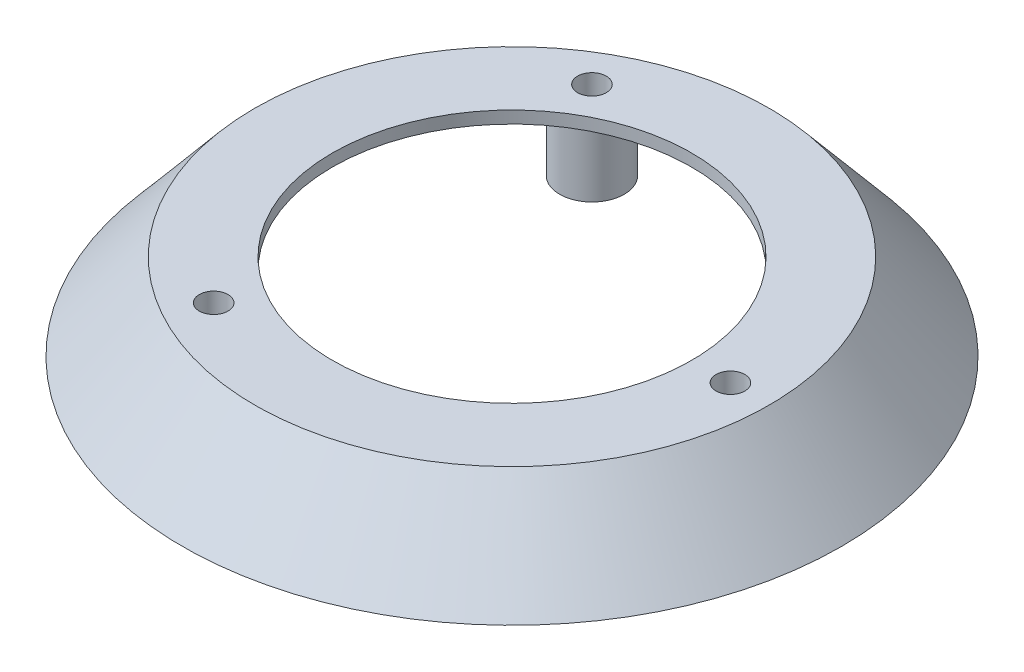
ISO-10303-21;
HEADER;
FILE_DESCRIPTION(('STEP AP214'),'2;1');
FILE_NAME('part.step','',(''),(''),'','','');
FILE_SCHEMA(('AUTOMOTIVE_DESIGN { 1 0 10303 214 1 1 1 1 }'));
ENDSEC;
DATA;
#1=APPLICATION_CONTEXT('core data for automotive mechanical design processes');
#2=APPLICATION_PROTOCOL_DEFINITION('international standard','automotive_design',2000,#1);
#3=PRODUCT_CONTEXT('',#1,'mechanical');
#4=PRODUCT('Part','Part','',(#3));
#5=PRODUCT_RELATED_PRODUCT_CATEGORY('part','',(#4));
#6=PRODUCT_DEFINITION_FORMATION('','',#4);
#7=PRODUCT_DEFINITION_CONTEXT('part definition',#1,'design');
#8=PRODUCT_DEFINITION('design','',#6,#7);
#9=PRODUCT_DEFINITION_SHAPE('','',#8);
#10=(LENGTH_UNIT() NAMED_UNIT(*) SI_UNIT(.MILLI.,.METRE.));
#11=(NAMED_UNIT(*) PLANE_ANGLE_UNIT() SI_UNIT($,.RADIAN.));
#12=(NAMED_UNIT(*) SI_UNIT($,.STERADIAN.) SOLID_ANGLE_UNIT());
#13=UNCERTAINTY_MEASURE_WITH_UNIT(LENGTH_MEASURE(1.E-05),#10,'distance_accuracy_value','');
#14=(GEOMETRIC_REPRESENTATION_CONTEXT(3) GLOBAL_UNCERTAINTY_ASSIGNED_CONTEXT((#13)) GLOBAL_UNIT_ASSIGNED_CONTEXT((#10,
#11,#12)) REPRESENTATION_CONTEXT('',''));
#15=CARTESIAN_POINT('',(0.,0.,0.));
#16=DIRECTION('',(0.,0.,1.));
#17=DIRECTION('',(1.,0.,0.));
#18=AXIS2_PLACEMENT_3D('',#15,#16,#17);
#19=CARTESIAN_POINT('',(-35.,-1.7,0.));
#20=DIRECTION('',(0.,-1.,0.));
#21=DIRECTION('',(1.,0.,0.));
#22=AXIS2_PLACEMENT_3D('',#19,#20,#21);
#23=PLANE('',#22);
#24=CARTESIAN_POINT('',(-15.198180754716,-1.7,-26.3240212497833));
#25=DIRECTION('',(0.,-1.,0.));
#26=DIRECTION('',(-0.500000000000004,0.,-0.866025403784436));
#27=AXIS2_PLACEMENT_3D('',#24,#25,#26);
#28=CIRCLE('',#27,4.5);
#29=CARTESIAN_POINT('',(-19.698180754716,-1.7,-26.3240212497833));
#30=VERTEX_POINT('',#29);
#31=EDGE_CURVE('E87',#30,#30,#28,.T.);
#32=ORIENTED_EDGE('',*,*,#31,.F.);
#33=EDGE_LOOP('',(#32));
#34=FACE_BOUND('',#33,.T.);
#35=CARTESIAN_POINT('',(0.,-1.7,0.));
#36=DIRECTION('',(0.,1.,0.));
#37=DIRECTION('',(-1.,0.,0.));
#38=AXIS2_PLACEMENT_3D('',#35,#36,#37);
#39=CIRCLE('',#38,35.);
#40=CARTESIAN_POINT('',(-35.,-1.7,0.));
#41=VERTEX_POINT('',#40);
#42=EDGE_CURVE('E59',#41,#41,#39,.T.);
#43=ORIENTED_EDGE('',*,*,#42,.F.);
#44=EDGE_LOOP('',(#43));
#45=FACE_BOUND('',#44,.T.);
#46=CARTESIAN_POINT('',(0.,-1.7,0.));
#47=DIRECTION('',(0.,1.,0.));
#48=DIRECTION('',(-1.,0.,0.));
#49=AXIS2_PLACEMENT_3D('',#46,#47,#48);
#50=CIRCLE('',#49,25.);
#51=CARTESIAN_POINT('',(-25.,-1.7,0.));
#52=VERTEX_POINT('',#51);
#53=EDGE_CURVE('E62',#52,#52,#50,.T.);
#54=ORIENTED_EDGE('',*,*,#53,.T.);
#55=EDGE_LOOP('',(#54));
#56=FACE_BOUND('',#55,.T.);
#57=CARTESIAN_POINT('',(30.3963615094318,-1.69999999999999,0.));
#58=DIRECTION('',(0.,-1.,0.));
#59=DIRECTION('',(1.,0.,0.));
#60=AXIS2_PLACEMENT_3D('',#57,#58,#59);
#61=CIRCLE('',#60,4.5);
#62=CARTESIAN_POINT('',(25.8963615094318,-1.69999999999999,0.));
#63=VERTEX_POINT('',#62);
#64=EDGE_CURVE('E72',#63,#63,#61,.T.);
#65=ORIENTED_EDGE('',*,*,#64,.F.);
#66=EDGE_LOOP('',(#65));
#67=FACE_BOUND('',#66,.T.);
#68=CARTESIAN_POINT('',(-15.1981807547156,-1.7,26.3240212497835));
#69=DIRECTION('',(0.,-1.,0.));
#70=DIRECTION('',(-0.499999999999992,0.,0.866025403784443));
#71=AXIS2_PLACEMENT_3D('',#68,#69,#70);
#72=CIRCLE('',#71,4.5);
#73=CARTESIAN_POINT('',(-17.4481807547156,-1.7,30.2211355668135));
#74=VERTEX_POINT('',#73);
#75=EDGE_CURVE('E96',#74,#74,#72,.T.);
#76=ORIENTED_EDGE('',*,*,#75,.F.);
#77=EDGE_LOOP('',(#76));
#78=FACE_BOUND('',#77,.T.);
#79=ADVANCED_FACE('F39',(#34,#45,#56,#67,#78),#23,.T.);
#80=CARTESIAN_POINT('',(0.,0.,0.));
#81=DIRECTION('',(0.,1.,0.));
#82=DIRECTION('',(-1.,0.,0.));
#83=AXIS2_PLACEMENT_3D('',#80,#81,#82);
#84=CYLINDRICAL_SURFACE('',#83,25.);
#85=CARTESIAN_POINT('',(0.,0.,0.));
#86=DIRECTION('',(0.,1.,0.));
#87=DIRECTION('',(-1.,0.,0.));
#88=AXIS2_PLACEMENT_3D('',#85,#86,#87);
#89=CIRCLE('',#88,25.);
#90=CARTESIAN_POINT('',(-25.,0.,0.));
#91=VERTEX_POINT('',#90);
#92=EDGE_CURVE('E11',#91,#91,#89,.T.);
#93=ORIENTED_EDGE('',*,*,#92,.T.);
#94=EDGE_LOOP('',(#93));
#95=FACE_BOUND('',#94,.T.);
#96=ORIENTED_EDGE('',*,*,#53,.F.);
#97=EDGE_LOOP('',(#96));
#98=FACE_BOUND('',#97,.T.);
#99=ADVANCED_FACE('F41',(#95,#98),#84,.F.);
#100=CARTESIAN_POINT('',(-25.,0.,0.));
#101=DIRECTION('',(0.,1.,0.));
#102=DIRECTION('',(-1.,0.,0.));
#103=AXIS2_PLACEMENT_3D('',#100,#101,#102);
#104=PLANE('',#103);
#105=CARTESIAN_POINT('',(-15.1981807547156,0.,26.3240212497835));
#106=DIRECTION('',(0.,1.,0.));
#107=DIRECTION('',(0.499999999999992,0.,-0.866025403784443));
#108=AXIS2_PLACEMENT_3D('',#105,#106,#107);
#109=CIRCLE('',#108,2.);
#110=CARTESIAN_POINT('',(-14.1981807547156,0.,24.5919704422147));
#111=VERTEX_POINT('',#110);
#112=EDGE_CURVE('E80',#111,#111,#109,.T.);
#113=ORIENTED_EDGE('',*,*,#112,.F.);
#114=EDGE_LOOP('',(#113));
#115=FACE_BOUND('',#114,.T.);
#116=CARTESIAN_POINT('',(-15.198180754716,0.,-26.3240212497833));
#117=DIRECTION('',(0.,1.,0.));
#118=DIRECTION('',(0.500000000000004,0.,0.866025403784436));
#119=AXIS2_PLACEMENT_3D('',#116,#117,#118);
#120=CIRCLE('',#119,2.);
#121=CARTESIAN_POINT('',(-14.198180754716,0.,-24.5919704422145));
#122=VERTEX_POINT('',#121);
#123=EDGE_CURVE('E73',#122,#122,#120,.T.);
#124=ORIENTED_EDGE('',*,*,#123,.F.);
#125=EDGE_LOOP('',(#124));
#126=FACE_BOUND('',#125,.T.);
#127=CARTESIAN_POINT('',(30.3963615094318,0.,0.));
#128=DIRECTION('',(0.,1.,0.));
#129=DIRECTION('',(-1.,0.,0.));
#130=AXIS2_PLACEMENT_3D('',#127,#128,#129);
#131=CIRCLE('',#130,2.);
#132=CARTESIAN_POINT('',(28.3963615094318,0.,0.));
#133=VERTEX_POINT('',#132);
#134=EDGE_CURVE('E65',#133,#133,#131,.T.);
#135=ORIENTED_EDGE('',*,*,#134,.F.);
#136=EDGE_LOOP('',(#135));
#137=FACE_BOUND('',#136,.T.);
#138=CARTESIAN_POINT('',(0.,0.,0.));
#139=DIRECTION('',(0.,1.,0.));
#140=DIRECTION('',(-1.,0.,0.));
#141=AXIS2_PLACEMENT_3D('',#138,#139,#140);
#142=CIRCLE('',#141,35.7927230188635);
#143=CARTESIAN_POINT('',(-35.7927230188635,0.,0.));
#144=VERTEX_POINT('',#143);
#145=EDGE_CURVE('E46',#144,#144,#142,.T.);
#146=ORIENTED_EDGE('',*,*,#145,.T.);
#147=EDGE_LOOP('',(#146));
#148=FACE_BOUND('',#147,.T.);
#149=ORIENTED_EDGE('',*,*,#92,.F.);
#150=EDGE_LOOP('',(#149));
#151=FACE_BOUND('',#150,.T.);
#152=ADVANCED_FACE('F124',(#115,#126,#137,#148,#151),#104,.T.);
#153=CARTESIAN_POINT('',(0.,0.,0.));
#154=DIRECTION('',(0.,-1.,0.));
#155=DIRECTION('',(1.,0.,0.));
#156=AXIS2_PLACEMENT_3D('',#153,#154,#155);
#157=CONICAL_SURFACE('',#156,35.7927230188635,0.698131700797729);
#158=CARTESIAN_POINT('',(0.,-12.,0.));
#159=DIRECTION('',(0.,1.,0.));
#160=DIRECTION('',(-1.,0.,0.));
#161=AXIS2_PLACEMENT_3D('',#158,#159,#160);
#162=CIRCLE('',#161,45.8619185929908);
#163=CARTESIAN_POINT('',(-45.8619185929908,-12.,0.));
#164=VERTEX_POINT('',#163);
#165=EDGE_CURVE('E50',#164,#164,#162,.T.);
#166=ORIENTED_EDGE('',*,*,#165,.T.);
#167=EDGE_LOOP('',(#166));
#168=FACE_BOUND('',#167,.T.);
#169=ORIENTED_EDGE('',*,*,#145,.F.);
#170=EDGE_LOOP('',(#169));
#171=FACE_BOUND('',#170,.T.);
#172=ADVANCED_FACE('F138',(#168,#171),#157,.T.);
#173=CARTESIAN_POINT('',(-45.8619185929908,-12.,0.));
#174=DIRECTION('',(0.,-1.,0.));
#175=DIRECTION('',(1.,0.,0.));
#176=AXIS2_PLACEMENT_3D('',#173,#174,#175);
#177=PLANE('',#176);
#178=CARTESIAN_POINT('',(0.,-12.,0.));
#179=DIRECTION('',(0.,1.,0.));
#180=DIRECTION('',(-1.,0.,0.));
#181=AXIS2_PLACEMENT_3D('',#178,#179,#180);
#182=CIRCLE('',#181,43.6427262011259);
#183=CARTESIAN_POINT('',(-43.6427262011259,-12.,0.));
#184=VERTEX_POINT('',#183);
#185=EDGE_CURVE('E54',#184,#184,#182,.T.);
#186=ORIENTED_EDGE('',*,*,#185,.T.);
#187=EDGE_LOOP('',(#186));
#188=FACE_BOUND('',#187,.T.);
#189=ORIENTED_EDGE('',*,*,#165,.F.);
#190=EDGE_LOOP('',(#189));
#191=FACE_BOUND('',#190,.T.);
#192=ADVANCED_FACE('F134',(#188,#191),#177,.T.);
#193=CARTESIAN_POINT('',(0.,-12.,0.));
#194=DIRECTION('',(0.,-1.,0.));
#195=DIRECTION('',(1.,0.,0.));
#196=AXIS2_PLACEMENT_3D('',#193,#194,#195);
#197=CONICAL_SURFACE('',#196,43.6427262011259,0.698131700797729);
#198=ORIENTED_EDGE('',*,*,#42,.T.);
#199=EDGE_LOOP('',(#198));
#200=FACE_BOUND('',#199,.T.);
#201=ORIENTED_EDGE('',*,*,#185,.F.);
#202=EDGE_LOOP('',(#201));
#203=FACE_BOUND('',#202,.T.);
#204=ADVANCED_FACE('F131',(#200,#203),#197,.F.);
#205=CARTESIAN_POINT('',(30.3963615094318,-12.,0.));
#206=DIRECTION('',(0.,1.,0.));
#207=DIRECTION('',(-1.,0.,0.));
#208=AXIS2_PLACEMENT_3D('',#205,#206,#207);
#209=CYLINDRICAL_SURFACE('',#208,2.);
#210=ORIENTED_EDGE('',*,*,#134,.T.);
#211=EDGE_LOOP('',(#210));
#212=FACE_BOUND('',#211,.T.);
#213=CARTESIAN_POINT('',(30.3963615094318,-11.,0.));
#214=DIRECTION('',(0.,-1.,0.));
#215=DIRECTION('',(1.,0.,0.));
#216=AXIS2_PLACEMENT_3D('',#213,#214,#215);
#217=CIRCLE('',#216,2.);
#218=CARTESIAN_POINT('',(32.3963615094318,-11.,0.));
#219=VERTEX_POINT('',#218);
#220=EDGE_CURVE('E69',#219,#219,#217,.T.);
#221=ORIENTED_EDGE('',*,*,#220,.T.);
#222=EDGE_LOOP('',(#221));
#223=FACE_BOUND('',#222,.T.);
#224=ADVANCED_FACE('F129',(#212,#223),#209,.F.);
#225=CARTESIAN_POINT('',(30.3963615094318,-24.7279220613578,0.));
#226=DIRECTION('',(0.,1.,0.));
#227=DIRECTION('',(-1.,0.,0.));
#228=AXIS2_PLACEMENT_3D('',#225,#226,#227);
#229=CYLINDRICAL_SURFACE('',#228,4.5);
#230=CARTESIAN_POINT('',(30.3963615094318,-11.,0.));
#231=DIRECTION('',(0.,-1.,0.));
#232=DIRECTION('',(1.,0.,0.));
#233=AXIS2_PLACEMENT_3D('',#230,#231,#232);
#234=CIRCLE('',#233,4.5);
#235=CARTESIAN_POINT('',(25.8963615094318,-11.,0.));
#236=VERTEX_POINT('',#235);
#237=EDGE_CURVE('E68',#236,#236,#234,.T.);
#238=CARTESIAN_POINT('',(25.8963615094318,-1.69999999999999,0.));
#239=CARTESIAN_POINT('',(25.8963615094318,-1.79687499999999,0.));
#240=CARTESIAN_POINT('',(25.8963615094318,-1.89374999999999,0.));
#241=CARTESIAN_POINT('',(25.8963615094318,-2.08749999999999,0.));
#242=CARTESIAN_POINT('',(25.8963615094318,-2.18437499999999,0.));
#243=CARTESIAN_POINT('',(25.8963615094318,-2.37812499999999,0.));
#244=CARTESIAN_POINT('',(25.8963615094318,-2.47499999999999,0.));
#245=CARTESIAN_POINT('',(25.8963615094318,-2.66874999999999,0.));
#246=CARTESIAN_POINT('',(25.8963615094318,-2.76562499999999,0.));
#247=CARTESIAN_POINT('',(25.8963615094318,-2.95937499999999,0.));
#248=CARTESIAN_POINT('',(25.8963615094318,-3.05624999999999,0.));
#249=CARTESIAN_POINT('',(25.8963615094318,-3.24999999999999,0.));
#250=CARTESIAN_POINT('',(25.8963615094318,-3.34687499999999,0.));
#251=CARTESIAN_POINT('',(25.8963615094318,-3.54062499999999,0.));
#252=CARTESIAN_POINT('',(25.8963615094318,-3.63749999999999,0.));
#253=CARTESIAN_POINT('',(25.8963615094318,-3.83124999999999,0.));
#254=CARTESIAN_POINT('',(25.8963615094318,-3.92812499999999,0.));
#255=CARTESIAN_POINT('',(25.8963615094318,-4.12187499999999,0.));
#256=CARTESIAN_POINT('',(25.8963615094318,-4.21874999999999,0.));
#257=CARTESIAN_POINT('',(25.8963615094318,-4.41249999999999,0.));
#258=CARTESIAN_POINT('',(25.8963615094318,-4.50937499999999,0.));
#259=CARTESIAN_POINT('',(25.8963615094318,-4.70312499999999,0.));
#260=CARTESIAN_POINT('',(25.8963615094318,-4.79999999999999,0.));
#261=CARTESIAN_POINT('',(25.8963615094318,-4.99374999999999,0.));
#262=CARTESIAN_POINT('',(25.8963615094318,-5.09062499999999,0.));
#263=CARTESIAN_POINT('',(25.8963615094318,-5.28437499999999,0.));
#264=CARTESIAN_POINT('',(25.8963615094318,-5.38124999999999,0.));
#265=CARTESIAN_POINT('',(25.8963615094318,-5.57499999999999,0.));
#266=CARTESIAN_POINT('',(25.8963615094318,-5.67187499999999,0.));
#267=CARTESIAN_POINT('',(25.8963615094318,-5.86562499999999,0.));
#268=CARTESIAN_POINT('',(25.8963615094318,-5.96249999999999,0.));
#269=CARTESIAN_POINT('',(25.8963615094318,-6.15624999999999,0.));
#270=CARTESIAN_POINT('',(25.8963615094318,-6.25312499999999,0.));
#271=CARTESIAN_POINT('',(25.8963615094318,-6.44687499999999,0.));
#272=CARTESIAN_POINT('',(25.8963615094318,-6.54374999999999,0.));
#273=CARTESIAN_POINT('',(25.8963615094318,-6.73749999999999,0.));
#274=CARTESIAN_POINT('',(25.8963615094318,-6.83437499999999,0.));
#275=CARTESIAN_POINT('',(25.8963615094318,-7.02812499999999,0.));
#276=CARTESIAN_POINT('',(25.8963615094318,-7.12499999999999,0.));
#277=CARTESIAN_POINT('',(25.8963615094318,-7.31874999999999,0.));
#278=CARTESIAN_POINT('',(25.8963615094318,-7.41562499999999,0.));
#279=CARTESIAN_POINT('',(25.8963615094318,-7.60937499999999,0.));
#280=CARTESIAN_POINT('',(25.8963615094318,-7.70624999999999,0.));
#281=CARTESIAN_POINT('',(25.8963615094318,-7.89999999999999,0.));
#282=CARTESIAN_POINT('',(25.8963615094318,-7.99687499999999,0.));
#283=CARTESIAN_POINT('',(25.8963615094318,-8.190625,0.));
#284=CARTESIAN_POINT('',(25.8963615094318,-8.28749999999999,0.));
#285=CARTESIAN_POINT('',(25.8963615094318,-8.48125,0.));
#286=CARTESIAN_POINT('',(25.8963615094318,-8.57812499999999,0.));
#287=CARTESIAN_POINT('',(25.8963615094318,-8.77187499999999,0.));
#288=CARTESIAN_POINT('',(25.8963615094318,-8.86875,0.));
#289=CARTESIAN_POINT('',(25.8963615094318,-9.06249999999999,0.));
#290=CARTESIAN_POINT('',(25.8963615094318,-9.15937499999999,0.));
#291=CARTESIAN_POINT('',(25.8963615094318,-9.35312499999999,0.));
#292=CARTESIAN_POINT('',(25.8963615094318,-9.44999999999999,0.));
#293=CARTESIAN_POINT('',(25.8963615094318,-9.64374999999999,0.));
#294=CARTESIAN_POINT('',(25.8963615094318,-9.74062499999999,0.));
#295=CARTESIAN_POINT('',(25.8963615094318,-9.93437499999999,0.));
#296=CARTESIAN_POINT('',(25.8963615094318,-10.03125,0.));
#297=CARTESIAN_POINT('',(25.8963615094318,-10.225,0.));
#298=CARTESIAN_POINT('',(25.8963615094318,-10.321875,0.));
#299=CARTESIAN_POINT('',(25.8963615094318,-10.515625,0.));
#300=CARTESIAN_POINT('',(25.8963615094318,-10.6125,0.));
#301=CARTESIAN_POINT('',(25.8963615094318,-10.80625,0.));
#302=CARTESIAN_POINT('',(25.8963615094318,-10.903125,0.));
#303=CARTESIAN_POINT('',(25.8963615094318,-11.,0.));
#304=B_SPLINE_CURVE_WITH_KNOTS('',3,(#238,#239,#240,#241,#242,#243,#244,#245,#246,#247,#248,
#249,#250,#251,#252,#253,#254,#255,#256,#257,#258,#259,#260,#261,#262,#263,#264,#265,#266,#267,
#268,#269,#270,#271,#272,#273,#274,#275,#276,#277,#278,#279,#280,#281,#282,#283,#284,#285,#286,
#287,#288,#289,#290,#291,#292,#293,#294,#295,#296,#297,#298,#299,#300,#301,#302,#303),
.UNSPECIFIED.,.F.,.F.,(4,2,2,2,2,2,2,2,2,2,2,2,2,2,2,2,2,2,2,2,2,2,2,2,2,2,2,2,2,2,2,2,4),(0.,
0.290624999999999,0.581250000000002,0.871875000000001,1.1625,1.453125,1.74375,2.034375,2.325,
2.615625,2.90625,3.196875,3.4875,3.778125,4.06875,4.359375,4.65,4.940625,5.23125,5.521875,
5.81250000000001,6.103125,6.39375,6.68437500000001,6.97500000000001,7.265625,7.55625,7.846875,
8.1375,8.428125,8.71875,9.009375,9.3),.UNSPECIFIED.);
#305=EDGE_CURVE('BSEAM155',#63,#236,#304,.T.);
#306=ORIENTED_EDGE('',*,*,#64,.T.);
#307=ORIENTED_EDGE('',*,*,#237,.F.);
#308=ORIENTED_EDGE('',*,*,#305,.T.);
#309=ORIENTED_EDGE('',*,*,#305,.F.);
#310=EDGE_LOOP('',(#306,#308,#307,#309));
#311=FACE_BOUND('',#310,.T.);
#312=ADVANCED_FACE('F155',(#311),#229,.T.);
#313=CARTESIAN_POINT('',(-45.8619185929908,-11.,0.));
#314=DIRECTION('',(0.,-1.,0.));
#315=DIRECTION('',(1.,0.,0.));
#316=AXIS2_PLACEMENT_3D('',#313,#314,#315);
#317=PLANE('',#316);
#318=ORIENTED_EDGE('',*,*,#220,.F.);
#319=EDGE_LOOP('',(#318));
#320=FACE_BOUND('',#319,.T.);
#321=ORIENTED_EDGE('',*,*,#237,.T.);
#322=EDGE_LOOP('',(#321));
#323=FACE_BOUND('',#322,.T.);
#324=ADVANCED_FACE('F158',(#320,#323),#317,.T.);
#325=CARTESIAN_POINT('',(-15.198180754716,-12.,-26.3240212497833));
#326=DIRECTION('',(0.,1.,0.));
#327=DIRECTION('',(-1.,0.,0.));
#328=AXIS2_PLACEMENT_3D('',#325,#326,#327);
#329=CYLINDRICAL_SURFACE('',#328,2.);
#330=ORIENTED_EDGE('',*,*,#123,.T.);
#331=EDGE_LOOP('',(#330));
#332=FACE_BOUND('',#331,.T.);
#333=CARTESIAN_POINT('',(-15.198180754716,-11.,-26.3240212497833));
#334=DIRECTION('',(0.,-1.,0.));
#335=DIRECTION('',(1.,0.,0.));
#336=AXIS2_PLACEMENT_3D('',#333,#334,#335);
#337=CIRCLE('',#336,2.);
#338=CARTESIAN_POINT('',(-13.198180754716,-11.,-26.3240212497833));
#339=VERTEX_POINT('',#338);
#340=EDGE_CURVE('E84',#339,#339,#337,.T.);
#341=ORIENTED_EDGE('',*,*,#340,.T.);
#342=EDGE_LOOP('',(#341));
#343=FACE_BOUND('',#342,.T.);
#344=ADVANCED_FACE('F161',(#332,#343),#329,.F.);
#345=CARTESIAN_POINT('',(-15.1981807547156,-12.,26.3240212497835));
#346=DIRECTION('',(0.,1.,0.));
#347=DIRECTION('',(-1.,0.,0.));
#348=AXIS2_PLACEMENT_3D('',#345,#346,#347);
#349=CYLINDRICAL_SURFACE('',#348,2.);
#350=ORIENTED_EDGE('',*,*,#112,.T.);
#351=EDGE_LOOP('',(#350));
#352=FACE_BOUND('',#351,.T.);
#353=CARTESIAN_POINT('',(-15.1981807547156,-11.,26.3240212497835));
#354=DIRECTION('',(0.,-1.,0.));
#355=DIRECTION('',(1.,0.,0.));
#356=AXIS2_PLACEMENT_3D('',#353,#354,#355);
#357=CIRCLE('',#356,2.);
#358=CARTESIAN_POINT('',(-13.1981807547156,-11.,26.3240212497835));
#359=VERTEX_POINT('',#358);
#360=EDGE_CURVE('E93',#359,#359,#357,.T.);
#361=ORIENTED_EDGE('',*,*,#360,.T.);
#362=EDGE_LOOP('',(#361));
#363=FACE_BOUND('',#362,.T.);
#364=ADVANCED_FACE('F172',(#352,#363),#349,.F.);
#365=CARTESIAN_POINT('',(-15.198180754716,-24.7279220613579,-26.3240212497833));
#366=DIRECTION('',(0.,1.,0.));
#367=DIRECTION('',(-1.,0.,0.));
#368=AXIS2_PLACEMENT_3D('',#365,#366,#367);
#369=CYLINDRICAL_SURFACE('',#368,4.5);
#370=CARTESIAN_POINT('',(-15.198180754716,-11.,-26.3240212497833));
#371=DIRECTION('',(0.,-1.,0.));
#372=DIRECTION('',(1.,0.,0.));
#373=AXIS2_PLACEMENT_3D('',#370,#371,#372);
#374=CIRCLE('',#373,4.5);
#375=CARTESIAN_POINT('',(-19.698180754716,-11.,-26.3240212497833));
#376=VERTEX_POINT('',#375);
#377=EDGE_CURVE('E83',#376,#376,#374,.T.);
#378=CARTESIAN_POINT('',(-19.698180754716,-1.7,-26.3240212497833));
#379=CARTESIAN_POINT('',(-19.698180754716,-1.796875,-26.3240212497833));
#380=CARTESIAN_POINT('',(-19.698180754716,-1.89375,-26.3240212497833));
#381=CARTESIAN_POINT('',(-19.698180754716,-2.0875,-26.3240212497833));
#382=CARTESIAN_POINT('',(-19.698180754716,-2.184375,-26.3240212497833));
#383=CARTESIAN_POINT('',(-19.698180754716,-2.378125,-26.3240212497833));
#384=CARTESIAN_POINT('',(-19.698180754716,-2.475,-26.3240212497833));
#385=CARTESIAN_POINT('',(-19.698180754716,-2.66875,-26.3240212497833));
#386=CARTESIAN_POINT('',(-19.698180754716,-2.765625,-26.3240212497833));
#387=CARTESIAN_POINT('',(-19.698180754716,-2.959375,-26.3240212497833));
#388=CARTESIAN_POINT('',(-19.698180754716,-3.05625,-26.3240212497833));
#389=CARTESIAN_POINT('',(-19.698180754716,-3.25,-26.3240212497833));
#390=CARTESIAN_POINT('',(-19.698180754716,-3.346875,-26.3240212497833));
#391=CARTESIAN_POINT('',(-19.698180754716,-3.540625,-26.3240212497833));
#392=CARTESIAN_POINT('',(-19.698180754716,-3.6375,-26.3240212497833));
#393=CARTESIAN_POINT('',(-19.698180754716,-3.83125,-26.3240212497833));
#394=CARTESIAN_POINT('',(-19.698180754716,-3.928125,-26.3240212497833));
#395=CARTESIAN_POINT('',(-19.698180754716,-4.121875,-26.3240212497833));
#396=CARTESIAN_POINT('',(-19.698180754716,-4.21875,-26.3240212497833));
#397=CARTESIAN_POINT('',(-19.698180754716,-4.4125,-26.3240212497833));
#398=CARTESIAN_POINT('',(-19.698180754716,-4.509375,-26.3240212497833));
#399=CARTESIAN_POINT('',(-19.698180754716,-4.703125,-26.3240212497833));
#400=CARTESIAN_POINT('',(-19.698180754716,-4.8,-26.3240212497833));
#401=CARTESIAN_POINT('',(-19.698180754716,-4.99375,-26.3240212497833));
#402=CARTESIAN_POINT('',(-19.698180754716,-5.090625,-26.3240212497833));
#403=CARTESIAN_POINT('',(-19.698180754716,-5.284375,-26.3240212497833));
#404=CARTESIAN_POINT('',(-19.698180754716,-5.38125,-26.3240212497833));
#405=CARTESIAN_POINT('',(-19.698180754716,-5.575,-26.3240212497833));
#406=CARTESIAN_POINT('',(-19.698180754716,-5.671875,-26.3240212497833));
#407=CARTESIAN_POINT('',(-19.698180754716,-5.865625,-26.3240212497833));
#408=CARTESIAN_POINT('',(-19.698180754716,-5.9625,-26.3240212497833));
#409=CARTESIAN_POINT('',(-19.698180754716,-6.15625,-26.3240212497833));
#410=CARTESIAN_POINT('',(-19.698180754716,-6.253125,-26.3240212497833));
#411=CARTESIAN_POINT('',(-19.698180754716,-6.446875,-26.3240212497833));
#412=CARTESIAN_POINT('',(-19.698180754716,-6.54375,-26.3240212497833));
#413=CARTESIAN_POINT('',(-19.698180754716,-6.7375,-26.3240212497833));
#414=CARTESIAN_POINT('',(-19.698180754716,-6.834375,-26.3240212497833));
#415=CARTESIAN_POINT('',(-19.698180754716,-7.028125,-26.3240212497833));
#416=CARTESIAN_POINT('',(-19.698180754716,-7.125,-26.3240212497833));
#417=CARTESIAN_POINT('',(-19.698180754716,-7.31875,-26.3240212497833));
#418=CARTESIAN_POINT('',(-19.698180754716,-7.415625,-26.3240212497833));
#419=CARTESIAN_POINT('',(-19.698180754716,-7.609375,-26.3240212497833));
#420=CARTESIAN_POINT('',(-19.698180754716,-7.70625,-26.3240212497833));
#421=CARTESIAN_POINT('',(-19.698180754716,-7.9,-26.3240212497833));
#422=CARTESIAN_POINT('',(-19.698180754716,-7.996875,-26.3240212497833));
#423=CARTESIAN_POINT('',(-19.698180754716,-8.190625,-26.3240212497833));
#424=CARTESIAN_POINT('',(-19.698180754716,-8.2875,-26.3240212497833));
#425=CARTESIAN_POINT('',(-19.698180754716,-8.48125,-26.3240212497833));
#426=CARTESIAN_POINT('',(-19.698180754716,-8.578125,-26.3240212497833));
#427=CARTESIAN_POINT('',(-19.698180754716,-8.771875,-26.3240212497833));
#428=CARTESIAN_POINT('',(-19.698180754716,-8.86875,-26.3240212497833));
#429=CARTESIAN_POINT('',(-19.698180754716,-9.0625,-26.3240212497833));
#430=CARTESIAN_POINT('',(-19.698180754716,-9.159375,-26.3240212497833));
#431=CARTESIAN_POINT('',(-19.698180754716,-9.353125,-26.3240212497833));
#432=CARTESIAN_POINT('',(-19.698180754716,-9.45,-26.3240212497833));
#433=CARTESIAN_POINT('',(-19.698180754716,-9.64375,-26.3240212497833));
#434=CARTESIAN_POINT('',(-19.698180754716,-9.740625,-26.3240212497833));
#435=CARTESIAN_POINT('',(-19.698180754716,-9.934375,-26.3240212497833));
#436=CARTESIAN_POINT('',(-19.698180754716,-10.03125,-26.3240212497833));
#437=CARTESIAN_POINT('',(-19.698180754716,-10.225,-26.3240212497833));
#438=CARTESIAN_POINT('',(-19.698180754716,-10.321875,-26.3240212497833));
#439=CARTESIAN_POINT('',(-19.698180754716,-10.515625,-26.3240212497833));
#440=CARTESIAN_POINT('',(-19.698180754716,-10.6125,-26.3240212497833));
#441=CARTESIAN_POINT('',(-19.698180754716,-10.80625,-26.3240212497833));
#442=CARTESIAN_POINT('',(-19.698180754716,-10.903125,-26.3240212497833));
#443=CARTESIAN_POINT('',(-19.698180754716,-11.,-26.3240212497833));
#444=B_SPLINE_CURVE_WITH_KNOTS('',3,(#378,#379,#380,#381,#382,#383,#384,#385,#386,#387,#388,
#389,#390,#391,#392,#393,#394,#395,#396,#397,#398,#399,#400,#401,#402,#403,#404,#405,#406,#407,
#408,#409,#410,#411,#412,#413,#414,#415,#416,#417,#418,#419,#420,#421,#422,#423,#424,#425,#426,
#427,#428,#429,#430,#431,#432,#433,#434,#435,#436,#437,#438,#439,#440,#441,#442,#443),
.UNSPECIFIED.,.F.,.F.,(4,2,2,2,2,2,2,2,2,2,2,2,2,2,2,2,2,2,2,2,2,2,2,2,2,2,2,2,2,2,2,2,4),(0.,
0.290624999999999,0.581249999999998,0.871875000000001,1.1625,1.453125,1.74375,2.034375,2.325,
2.615625,2.90625,3.196875,3.4875,3.778125,4.06875,4.359375,4.65,4.940625,5.23125,5.521875,
5.8125,6.103125,6.39375,6.684375,6.975,7.265625,7.55625,7.846875,8.1375,8.428125,8.71875,
9.009375,9.3),.UNSPECIFIED.);
#445=EDGE_CURVE('BSEAM115',#30,#376,#444,.T.);
#446=ORIENTED_EDGE('',*,*,#31,.T.);
#447=ORIENTED_EDGE('',*,*,#377,.F.);
#448=ORIENTED_EDGE('',*,*,#445,.T.);
#449=ORIENTED_EDGE('',*,*,#445,.F.);
#450=EDGE_LOOP('',(#446,#448,#447,#449));
#451=FACE_BOUND('',#450,.T.);
#452=ADVANCED_FACE('F115',(#451),#369,.T.);
#453=CARTESIAN_POINT('',(-45.8619185929908,-11.,0.));
#454=DIRECTION('',(0.,-1.,0.));
#455=DIRECTION('',(1.,0.,0.));
#456=AXIS2_PLACEMENT_3D('',#453,#454,#455);
#457=PLANE('',#456);
#458=ORIENTED_EDGE('',*,*,#340,.F.);
#459=EDGE_LOOP('',(#458));
#460=FACE_BOUND('',#459,.T.);
#461=ORIENTED_EDGE('',*,*,#377,.T.);
#462=EDGE_LOOP('',(#461));
#463=FACE_BOUND('',#462,.T.);
#464=ADVANCED_FACE('F106',(#460,#463),#457,.T.);
#465=CARTESIAN_POINT('',(-15.1981807547156,-24.7279220613578,26.3240212497835));
#466=DIRECTION('',(0.,1.,0.));
#467=DIRECTION('',(-1.,0.,0.));
#468=AXIS2_PLACEMENT_3D('',#465,#466,#467);
#469=CYLINDRICAL_SURFACE('',#468,4.5);
#470=ORIENTED_EDGE('',*,*,#75,.T.);
#471=EDGE_LOOP('',(#470));
#472=FACE_BOUND('',#471,.T.);
#473=CARTESIAN_POINT('',(-15.1981807547156,-11.,26.3240212497835));
#474=DIRECTION('',(0.,-1.,0.));
#475=DIRECTION('',(1.,0.,0.));
#476=AXIS2_PLACEMENT_3D('',#473,#474,#475);
#477=CIRCLE('',#476,4.5);
#478=CARTESIAN_POINT('',(-10.6981807547156,-11.,26.3240212497835));
#479=VERTEX_POINT('',#478);
#480=EDGE_CURVE('E88',#479,#479,#477,.T.);
#481=ORIENTED_EDGE('',*,*,#480,.F.);
#482=EDGE_LOOP('',(#481));
#483=FACE_BOUND('',#482,.T.);
#484=ADVANCED_FACE('F104',(#472,#483),#469,.T.);
#485=CARTESIAN_POINT('',(-45.8619185929908,-11.,0.));
#486=DIRECTION('',(0.,-1.,0.));
#487=DIRECTION('',(1.,0.,0.));
#488=AXIS2_PLACEMENT_3D('',#485,#486,#487);
#489=PLANE('',#488);
#490=ORIENTED_EDGE('',*,*,#360,.F.);
#491=EDGE_LOOP('',(#490));
#492=FACE_BOUND('',#491,.T.);
#493=ORIENTED_EDGE('',*,*,#480,.T.);
#494=EDGE_LOOP('',(#493));
#495=FACE_BOUND('',#494,.T.);
#496=ADVANCED_FACE('F102',(#492,#495),#489,.T.);
#497=CLOSED_SHELL('',(#79,#99,#152,#172,#192,#204,#224,#312,#324,#344,#364,#452,#464,#484,#496));
#498=MANIFOLD_SOLID_BREP('B2',#497);
#499=ADVANCED_BREP_SHAPE_REPRESENTATION('',(#18,#498),#14);
#500=SHAPE_DEFINITION_REPRESENTATION(#9,#499);
ENDSEC;
END-ISO-10303-21;
